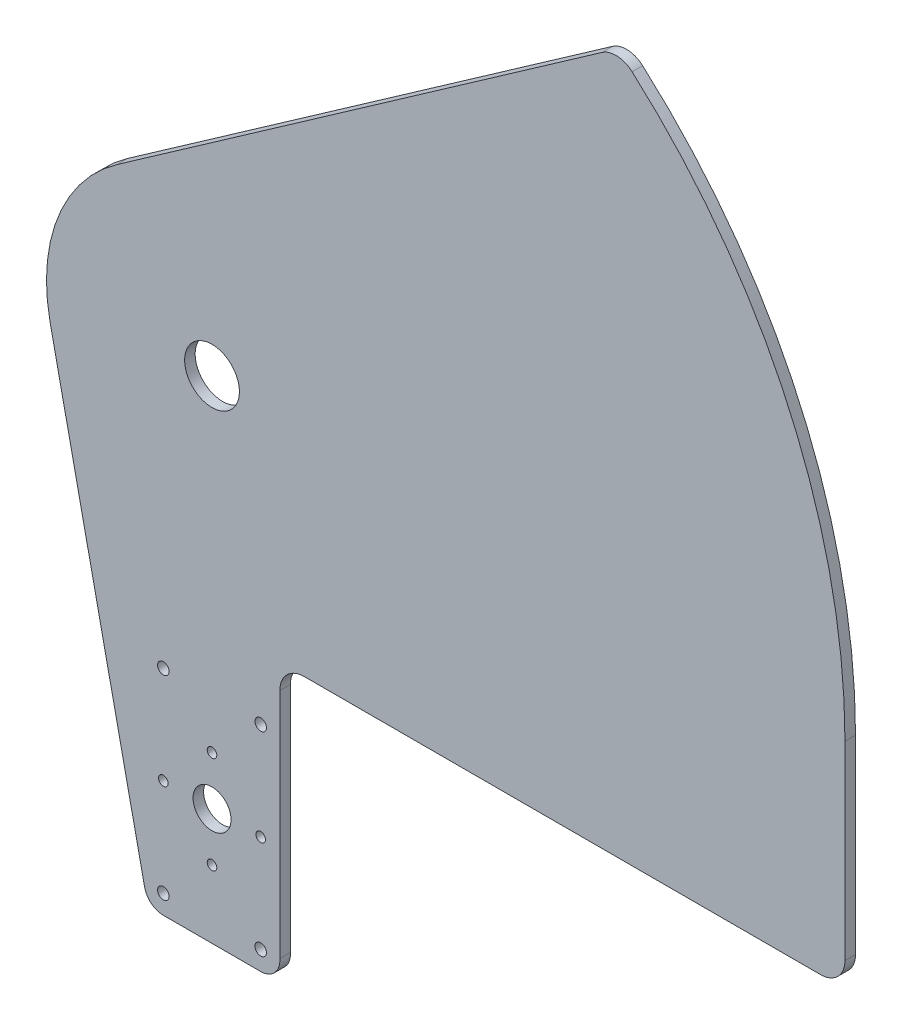
ISO-10303-21;
HEADER;
FILE_DESCRIPTION(('STEP AP214'),'2;1');
FILE_NAME('part.step','',(''),(''),'','','');
FILE_SCHEMA(('AUTOMOTIVE_DESIGN { 1 0 10303 214 1 1 1 1 }'));
ENDSEC;
DATA;
#1=APPLICATION_CONTEXT('core data for automotive mechanical design processes');
#2=APPLICATION_PROTOCOL_DEFINITION('international standard','automotive_design',2000,#1);
#3=PRODUCT_CONTEXT('',#1,'mechanical');
#4=PRODUCT('Part','Part','',(#3));
#5=PRODUCT_RELATED_PRODUCT_CATEGORY('part','',(#4));
#6=PRODUCT_DEFINITION_FORMATION('','',#4);
#7=PRODUCT_DEFINITION_CONTEXT('part definition',#1,'design');
#8=PRODUCT_DEFINITION('design','',#6,#7);
#9=PRODUCT_DEFINITION_SHAPE('','',#8);
#10=(LENGTH_UNIT() NAMED_UNIT(*) SI_UNIT(.MILLI.,.METRE.));
#11=(NAMED_UNIT(*) PLANE_ANGLE_UNIT() SI_UNIT($,.RADIAN.));
#12=(NAMED_UNIT(*) SI_UNIT($,.STERADIAN.) SOLID_ANGLE_UNIT());
#13=UNCERTAINTY_MEASURE_WITH_UNIT(LENGTH_MEASURE(1.E-05),#10,'distance_accuracy_value','');
#14=(GEOMETRIC_REPRESENTATION_CONTEXT(3) GLOBAL_UNCERTAINTY_ASSIGNED_CONTEXT((#13)) GLOBAL_UNIT_ASSIGNED_CONTEXT((#10,
#11,#12)) REPRESENTATION_CONTEXT('',''));
#15=CARTESIAN_POINT('',(0.,0.,0.));
#16=DIRECTION('',(0.,0.,1.));
#17=DIRECTION('',(1.,0.,0.));
#18=AXIS2_PLACEMENT_3D('',#15,#16,#17);
#19=CARTESIAN_POINT('',(0.,0.,2.75));
#20=DIRECTION('',(0.,0.,1.));
#21=DIRECTION('',(1.,0.,0.));
#22=AXIS2_PLACEMENT_3D('',#19,#20,#21);
#23=PLANE('',#22);
#24=CARTESIAN_POINT('',(25.4,-144.78,2.75));
#25=DIRECTION('',(0.,0.,1.));
#26=DIRECTION('',(1.,0.,0.));
#27=AXIS2_PLACEMENT_3D('',#24,#25,#26);
#28=CIRCLE('',#27,3.);
#29=CARTESIAN_POINT('',(28.4,-144.78,2.75));
#30=VERTEX_POINT('',#29);
#31=EDGE_CURVE('E434',#30,#30,#28,.F.);
#32=ORIENTED_EDGE('',*,*,#31,.T.);
#33=EDGE_LOOP('',(#32));
#34=FACE_BOUND('',#33,.T.);
#35=CARTESIAN_POINT('',(0.,0.,2.75));
#36=DIRECTION('',(0.,0.,1.));
#37=DIRECTION('',(1.,0.,0.));
#38=AXIS2_PLACEMENT_3D('',#35,#36,#37);
#39=CIRCLE('',#38,86.36);
#40=CARTESIAN_POINT('',(-49.5340610432764,70.7419705447973,2.75));
#41=VERTEX_POINT('',#40);
#42=CARTESIAN_POINT('',(-84.4506858636879,-18.0591045501353,2.75));
#43=VERTEX_POINT('',#42);
#44=EDGE_CURVE('E214',#41,#43,#39,.T.);
#45=ORIENTED_EDGE('',*,*,#44,.T.);
#46=DIRECTION('',(0.209114225916342,-0.97789122120991,0.));
#47=VECTOR('',#46,1.);
#48=CARTESIAN_POINT('',(-84.4506858636879,-18.0591045501353,2.75));
#49=LINE('',#48,#47);
#50=CARTESIAN_POINT('',(-35.1789122120991,-248.471142259163,2.75));
#51=VERTEX_POINT('',#50);
#52=EDGE_CURVE('E142',#43,#51,#49,.T.);
#53=ORIENTED_EDGE('',*,*,#52,.T.);
#54=CARTESIAN_POINT('',(-25.3999999999998,-246.38,2.75));
#55=DIRECTION('',(0.,0.,1.));
#56=DIRECTION('',(1.,0.,0.));
#57=AXIS2_PLACEMENT_3D('',#54,#55,#56);
#58=CIRCLE('',#57,10.0000000000001);
#59=CARTESIAN_POINT('',(-25.3999999999998,-256.38,2.75));
#60=VERTEX_POINT('',#59);
#61=EDGE_CURVE('E157',#60,#51,#58,.F.);
#62=ORIENTED_EDGE('',*,*,#61,.F.);
#63=DIRECTION('',(1.,0.,0.));
#64=VECTOR('',#63,1.);
#65=CARTESIAN_POINT('',(1.12062590178503E-12,-256.38,2.75));
#66=LINE('',#65,#64);
#67=CARTESIAN_POINT('',(25.4000000000002,-256.38,2.75));
#68=VERTEX_POINT('',#67);
#69=EDGE_CURVE('E156',#60,#68,#66,.T.);
#70=ORIENTED_EDGE('',*,*,#69,.T.);
#71=CARTESIAN_POINT('',(25.4000000000002,-246.38,2.75));
#72=DIRECTION('',(0.,0.,1.));
#73=DIRECTION('',(1.,0.,0.));
#74=AXIS2_PLACEMENT_3D('',#71,#72,#73);
#75=CIRCLE('',#74,10.);
#76=CARTESIAN_POINT('',(35.3690479138296,-245.593817011266,2.75));
#77=VERTEX_POINT('',#76);
#78=EDGE_CURVE('E282',#68,#77,#75,.T.);
#79=ORIENTED_EDGE('',*,*,#78,.T.);
#80=DIRECTION('',(0.,1.,0.));
#81=VECTOR('',#80,1.);
#82=CARTESIAN_POINT('',(35.3690479138296,0.,2.75));
#83=LINE('',#82,#81);
#84=CARTESIAN_POINT('',(35.3690479138296,-124.46,2.75));
#85=VERTEX_POINT('',#84);
#86=EDGE_CURVE('E276',#77,#85,#83,.T.);
#87=ORIENTED_EDGE('',*,*,#86,.T.);
#88=CARTESIAN_POINT('',(48.0690479138296,-124.46,2.74999999999997));
#89=DIRECTION('',(0.,0.,1.));
#90=DIRECTION('',(1.,0.,0.));
#91=AXIS2_PLACEMENT_3D('',#88,#89,#90);
#92=CIRCLE('',#91,12.7);
#93=CARTESIAN_POINT('',(48.0690479138296,-111.76,2.75));
#94=VERTEX_POINT('',#93);
#95=EDGE_CURVE('E46',#85,#94,#92,.F.);
#96=ORIENTED_EDGE('',*,*,#95,.T.);
#97=DIRECTION('',(1.,0.,0.));
#98=VECTOR('',#97,1.);
#99=CARTESIAN_POINT('',(0.,-111.76,2.75));
#100=LINE('',#99,#98);
#101=CARTESIAN_POINT('',(317.5,-111.76,2.75));
#102=VERTEX_POINT('',#101);
#103=EDGE_CURVE('E218',#94,#102,#100,.T.);
#104=ORIENTED_EDGE('',*,*,#103,.T.);
#105=CARTESIAN_POINT('',(317.5,-99.06,2.75));
#106=DIRECTION('',(0.,0.,1.));
#107=DIRECTION('',(1.,0.,0.));
#108=AXIS2_PLACEMENT_3D('',#105,#106,#107);
#109=CIRCLE('',#108,12.7);
#110=CARTESIAN_POINT('',(330.2,-99.06,2.75));
#111=VERTEX_POINT('',#110);
#112=EDGE_CURVE('E260',#102,#111,#109,.T.);
#113=ORIENTED_EDGE('',*,*,#112,.T.);
#114=DIRECTION('',(0.,1.,0.));
#115=VECTOR('',#114,1.);
#116=CARTESIAN_POINT('',(330.2,0.,2.75));
#117=LINE('',#116,#115);
#118=CARTESIAN_POINT('',(330.2,0.,2.75));
#119=VERTEX_POINT('',#118);
#120=EDGE_CURVE('E220',#111,#119,#117,.T.);
#121=ORIENTED_EDGE('',*,*,#120,.T.);
#122=CARTESIAN_POINT('',(0.,0.,2.75));
#123=DIRECTION('',(0.,0.,1.));
#124=DIRECTION('',(1.,0.,0.));
#125=AXIS2_PLACEMENT_3D('',#122,#123,#124);
#126=CIRCLE('',#125,330.2);
#127=CARTESIAN_POINT('',(219.164435587502,246.979736362342,2.75));
#128=VERTEX_POINT('',#127);
#129=EDGE_CURVE('E222',#119,#128,#126,.T.);
#130=ORIENTED_EDGE('',*,*,#129,.T.);
#131=CARTESIAN_POINT('',(210.735034218752,237.480515733021,2.75));
#132=DIRECTION('',(0.,0.,1.));
#133=DIRECTION('',(1.,0.,0.));
#134=AXIS2_PLACEMENT_3D('',#131,#132,#133);
#135=CIRCLE('',#134,12.7);
#136=CARTESIAN_POINT('',(203.450613477094,247.883746695491,2.75));
#137=VERTEX_POINT('',#136);
#138=EDGE_CURVE('E258',#128,#137,#135,.T.);
#139=ORIENTED_EDGE('',*,*,#138,.T.);
#140=DIRECTION('',(0.819152044288991,0.573576436351047,0.));
#141=VECTOR('',#140,1.);
#142=CARTESIAN_POINT('',(-49.5340610432765,70.7419705447973,2.75));
#143=LINE('',#142,#141);
#144=EDGE_CURVE('E225',#41,#137,#143,.T.);
#145=ORIENTED_EDGE('',*,*,#144,.F.);
#146=EDGE_LOOP('',(#45,#53,#62,#70,#79,#87,#96,#104,#113,#121,#130,#139,#145));
#147=FACE_BOUND('',#146,.T.);
#148=CARTESIAN_POINT('',(0.,0.,2.75));
#149=DIRECTION('',(0.,0.,1.));
#150=DIRECTION('',(1.,0.,0.));
#151=AXIS2_PLACEMENT_3D('',#148,#149,#150);
#152=CIRCLE('',#151,14.2875);
#153=CARTESIAN_POINT('',(14.2875,0.,2.75));
#154=VERTEX_POINT('',#153);
#155=EDGE_CURVE('E211',#154,#154,#152,.T.);
#156=ORIENTED_EDGE('',*,*,#155,.F.);
#157=EDGE_LOOP('',(#156));
#158=FACE_BOUND('',#157,.T.);
#159=CARTESIAN_POINT('',(0.,-195.58,2.75));
#160=DIRECTION('',(0.,0.,1.));
#161=DIRECTION('',(1.,0.,0.));
#162=AXIS2_PLACEMENT_3D('',#159,#160,#161);
#163=CIRCLE('',#162,9.906);
#164=CARTESIAN_POINT('',(9.90600000000003,-195.58,2.75));
#165=VERTEX_POINT('',#164);
#166=EDGE_CURVE('E176',#165,#165,#163,.T.);
#167=ORIENTED_EDGE('',*,*,#166,.F.);
#168=EDGE_LOOP('',(#167));
#169=FACE_BOUND('',#168,.T.);
#170=CARTESIAN_POINT('',(0.,-170.18,2.75));
#171=DIRECTION('',(0.,0.,1.));
#172=DIRECTION('',(1.,0.,0.));
#173=AXIS2_PLACEMENT_3D('',#170,#171,#172);
#174=CIRCLE('',#173,2.5);
#175=CARTESIAN_POINT('',(2.49999999999997,-170.18,2.75));
#176=VERTEX_POINT('',#175);
#177=EDGE_CURVE('E198',#176,#176,#174,.T.);
#178=ORIENTED_EDGE('',*,*,#177,.F.);
#179=EDGE_LOOP('',(#178));
#180=FACE_BOUND('',#179,.T.);
#181=CARTESIAN_POINT('',(25.4,-195.58,2.75));
#182=DIRECTION('',(0.,0.,1.));
#183=DIRECTION('',(1.,0.,0.));
#184=AXIS2_PLACEMENT_3D('',#181,#182,#183);
#185=CIRCLE('',#184,2.49999999999988);
#186=CARTESIAN_POINT('',(27.8999999999999,-195.58,2.75));
#187=VERTEX_POINT('',#186);
#188=EDGE_CURVE('E201',#187,#187,#185,.T.);
#189=ORIENTED_EDGE('',*,*,#188,.F.);
#190=EDGE_LOOP('',(#189));
#191=FACE_BOUND('',#190,.T.);
#192=CARTESIAN_POINT('',(0.,-220.98,2.75));
#193=DIRECTION('',(0.,0.,1.));
#194=DIRECTION('',(1.,0.,0.));
#195=AXIS2_PLACEMENT_3D('',#192,#193,#194);
#196=CIRCLE('',#195,2.50000000000001);
#197=CARTESIAN_POINT('',(2.5000000000001,-220.98,2.75));
#198=VERTEX_POINT('',#197);
#199=EDGE_CURVE('E204',#198,#198,#196,.T.);
#200=ORIENTED_EDGE('',*,*,#199,.F.);
#201=EDGE_LOOP('',(#200));
#202=FACE_BOUND('',#201,.T.);
#203=CARTESIAN_POINT('',(-25.4,-195.58,2.75));
#204=DIRECTION('',(0.,0.,1.));
#205=DIRECTION('',(1.,0.,0.));
#206=AXIS2_PLACEMENT_3D('',#203,#204,#205);
#207=CIRCLE('',#206,2.49999999999976);
#208=CARTESIAN_POINT('',(-22.9000000000002,-195.58,2.75));
#209=VERTEX_POINT('',#208);
#210=EDGE_CURVE('E192',#209,#209,#207,.T.);
#211=ORIENTED_EDGE('',*,*,#210,.F.);
#212=EDGE_LOOP('',(#211));
#213=FACE_BOUND('',#212,.T.);
#214=CARTESIAN_POINT('',(-25.3999999999998,-246.38,2.75));
#215=DIRECTION('',(0.,0.,1.));
#216=DIRECTION('',(1.,0.,0.));
#217=AXIS2_PLACEMENT_3D('',#214,#215,#216);
#218=CIRCLE('',#217,3.);
#219=CARTESIAN_POINT('',(-22.3999999999998,-246.38,2.75));
#220=VERTEX_POINT('',#219);
#221=EDGE_CURVE('E170',#220,#220,#218,.F.);
#222=ORIENTED_EDGE('',*,*,#221,.T.);
#223=EDGE_LOOP('',(#222));
#224=FACE_BOUND('',#223,.T.);
#225=CARTESIAN_POINT('',(25.4000000000002,-246.38,2.75));
#226=DIRECTION('',(0.,0.,1.));
#227=DIRECTION('',(1.,0.,0.));
#228=AXIS2_PLACEMENT_3D('',#225,#226,#227);
#229=CIRCLE('',#228,2.99999999999999);
#230=CARTESIAN_POINT('',(28.4000000000002,-246.38,2.75));
#231=VERTEX_POINT('',#230);
#232=EDGE_CURVE('E171',#231,#231,#229,.T.);
#233=ORIENTED_EDGE('',*,*,#232,.F.);
#234=EDGE_LOOP('',(#233));
#235=FACE_BOUND('',#234,.T.);
#236=CARTESIAN_POINT('',(-25.4,-144.78,2.75));
#237=DIRECTION('',(0.,0.,1.));
#238=DIRECTION('',(1.,0.,0.));
#239=AXIS2_PLACEMENT_3D('',#236,#237,#238);
#240=CIRCLE('',#239,3.);
#241=CARTESIAN_POINT('',(-22.4,-144.78,2.75));
#242=VERTEX_POINT('',#241);
#243=EDGE_CURVE('E173',#242,#242,#240,.T.);
#244=ORIENTED_EDGE('',*,*,#243,.F.);
#245=EDGE_LOOP('',(#244));
#246=FACE_BOUND('',#245,.T.);
#247=ADVANCED_FACE('F38',(#34,#147,#158,#169,#180,#191,#202,#213,#224,#235,#246),#23,.T.);
#248=CARTESIAN_POINT('',(0.,0.,-2.75));
#249=DIRECTION('',(0.,0.,1.));
#250=DIRECTION('',(1.,0.,0.));
#251=AXIS2_PLACEMENT_3D('',#248,#249,#250);
#252=PLANE('',#251);
#253=CARTESIAN_POINT('',(25.4000000000002,-246.38,-2.74999999999997));
#254=DIRECTION('',(0.,0.,1.));
#255=DIRECTION('',(1.,0.,0.));
#256=AXIS2_PLACEMENT_3D('',#253,#254,#255);
#257=CIRCLE('',#256,2.99999999999999);
#258=CARTESIAN_POINT('',(28.4000000000002,-246.38,-2.74999999999997));
#259=VERTEX_POINT('',#258);
#260=EDGE_CURVE('E167',#259,#259,#257,.F.);
#261=ORIENTED_EDGE('',*,*,#260,.F.);
#262=EDGE_LOOP('',(#261));
#263=FACE_BOUND('',#262,.T.);
#264=CARTESIAN_POINT('',(-25.3999999999998,-246.38,-2.74999999999997));
#265=DIRECTION('',(0.,0.,1.));
#266=DIRECTION('',(1.,0.,0.));
#267=AXIS2_PLACEMENT_3D('',#264,#265,#266);
#268=CIRCLE('',#267,3.);
#269=CARTESIAN_POINT('',(-22.3999999999998,-246.38,-2.74999999999997));
#270=VERTEX_POINT('',#269);
#271=EDGE_CURVE('E174',#270,#270,#268,.T.);
#272=ORIENTED_EDGE('',*,*,#271,.T.);
#273=EDGE_LOOP('',(#272));
#274=FACE_BOUND('',#273,.T.);
#275=CARTESIAN_POINT('',(0.,-220.98,-2.75));
#276=DIRECTION('',(0.,0.,1.));
#277=DIRECTION('',(1.,0.,0.));
#278=AXIS2_PLACEMENT_3D('',#275,#276,#277);
#279=CIRCLE('',#278,2.50000000000001);
#280=CARTESIAN_POINT('',(2.5000000000001,-220.98,-2.75));
#281=VERTEX_POINT('',#280);
#282=EDGE_CURVE('E189',#281,#281,#279,.F.);
#283=ORIENTED_EDGE('',*,*,#282,.F.);
#284=EDGE_LOOP('',(#283));
#285=FACE_BOUND('',#284,.T.);
#286=CARTESIAN_POINT('',(0.,-170.18,-2.75));
#287=DIRECTION('',(0.,0.,1.));
#288=DIRECTION('',(1.,0.,0.));
#289=AXIS2_PLACEMENT_3D('',#286,#287,#288);
#290=CIRCLE('',#289,2.5);
#291=CARTESIAN_POINT('',(2.49999999999997,-170.18,-2.75));
#292=VERTEX_POINT('',#291);
#293=EDGE_CURVE('E186',#292,#292,#290,.F.);
#294=ORIENTED_EDGE('',*,*,#293,.F.);
#295=EDGE_LOOP('',(#294));
#296=FACE_BOUND('',#295,.T.);
#297=CARTESIAN_POINT('',(-25.4,-195.58,-2.75));
#298=DIRECTION('',(0.,0.,1.));
#299=DIRECTION('',(1.,0.,0.));
#300=AXIS2_PLACEMENT_3D('',#297,#298,#299);
#301=CIRCLE('',#300,2.49999999999976);
#302=CARTESIAN_POINT('',(-22.9000000000002,-195.58,-2.75));
#303=VERTEX_POINT('',#302);
#304=EDGE_CURVE('E184',#303,#303,#301,.F.);
#305=ORIENTED_EDGE('',*,*,#304,.F.);
#306=EDGE_LOOP('',(#305));
#307=FACE_BOUND('',#306,.T.);
#308=CARTESIAN_POINT('',(0.,-195.58,-2.75));
#309=DIRECTION('',(0.,0.,1.));
#310=DIRECTION('',(1.,0.,0.));
#311=AXIS2_PLACEMENT_3D('',#308,#309,#310);
#312=CIRCLE('',#311,9.906);
#313=CARTESIAN_POINT('',(9.90600000000003,-195.58,-2.75));
#314=VERTEX_POINT('',#313);
#315=EDGE_CURVE('E181',#314,#314,#312,.F.);
#316=ORIENTED_EDGE('',*,*,#315,.F.);
#317=EDGE_LOOP('',(#316));
#318=FACE_BOUND('',#317,.T.);
#319=CARTESIAN_POINT('',(25.4,-195.58,-2.75));
#320=DIRECTION('',(0.,0.,1.));
#321=DIRECTION('',(1.,0.,0.));
#322=AXIS2_PLACEMENT_3D('',#319,#320,#321);
#323=CIRCLE('',#322,2.49999999999988);
#324=CARTESIAN_POINT('',(27.8999999999999,-195.58,-2.75));
#325=VERTEX_POINT('',#324);
#326=EDGE_CURVE('E185',#325,#325,#323,.F.);
#327=ORIENTED_EDGE('',*,*,#326,.F.);
#328=EDGE_LOOP('',(#327));
#329=FACE_BOUND('',#328,.T.);
#330=CARTESIAN_POINT('',(0.,0.,-2.75));
#331=DIRECTION('',(0.,0.,1.));
#332=DIRECTION('',(1.,0.,0.));
#333=AXIS2_PLACEMENT_3D('',#330,#331,#332);
#334=CIRCLE('',#333,14.2875);
#335=CARTESIAN_POINT('',(14.2875,0.,-2.75));
#336=VERTEX_POINT('',#335);
#337=EDGE_CURVE('E195',#336,#336,#334,.T.);
#338=ORIENTED_EDGE('',*,*,#337,.T.);
#339=EDGE_LOOP('',(#338));
#340=FACE_BOUND('',#339,.T.);
#341=DIRECTION('',(-0.209114225916342,0.97789122120991,0.));
#342=VECTOR('',#341,1.);
#343=CARTESIAN_POINT('',(-84.4506858636879,-18.0591045501353,-2.74999999999997));
#344=LINE('',#343,#342);
#345=CARTESIAN_POINT('',(-35.1789122120991,-248.471142259163,-2.74999999999997));
#346=VERTEX_POINT('',#345);
#347=CARTESIAN_POINT('',(-84.4506858636878,-18.0591045501353,-2.74999999999997));
#348=VERTEX_POINT('',#347);
#349=EDGE_CURVE('E141',#346,#348,#344,.T.);
#350=ORIENTED_EDGE('',*,*,#349,.T.);
#351=CARTESIAN_POINT('',(0.,0.,-2.75));
#352=DIRECTION('',(0.,0.,1.));
#353=DIRECTION('',(1.,0.,0.));
#354=AXIS2_PLACEMENT_3D('',#351,#352,#353);
#355=CIRCLE('',#354,86.36);
#356=CARTESIAN_POINT('',(-49.5340610432764,70.7419705447973,-2.75));
#357=VERTEX_POINT('',#356);
#358=EDGE_CURVE('E231',#357,#348,#355,.T.);
#359=ORIENTED_EDGE('',*,*,#358,.F.);
#360=DIRECTION('',(0.819152044288991,0.573576436351047,0.));
#361=VECTOR('',#360,1.);
#362=CARTESIAN_POINT('',(-49.5340610432765,70.7419705447973,-2.75));
#363=LINE('',#362,#361);
#364=CARTESIAN_POINT('',(203.450613477094,247.883746695491,-2.75));
#365=VERTEX_POINT('',#364);
#366=EDGE_CURVE('E215',#357,#365,#363,.T.);
#367=ORIENTED_EDGE('',*,*,#366,.T.);
#368=CARTESIAN_POINT('',(210.735034218752,237.480515733021,-2.75));
#369=DIRECTION('',(0.,0.,1.));
#370=DIRECTION('',(1.,0.,0.));
#371=AXIS2_PLACEMENT_3D('',#368,#369,#370);
#372=CIRCLE('',#371,12.7);
#373=CARTESIAN_POINT('',(219.164435587502,246.979736362342,-2.75));
#374=VERTEX_POINT('',#373);
#375=EDGE_CURVE('E250',#365,#374,#372,.F.);
#376=ORIENTED_EDGE('',*,*,#375,.T.);
#377=CARTESIAN_POINT('',(0.,0.,-2.75));
#378=DIRECTION('',(0.,0.,1.));
#379=DIRECTION('',(1.,0.,0.));
#380=AXIS2_PLACEMENT_3D('',#377,#378,#379);
#381=CIRCLE('',#380,330.2);
#382=CARTESIAN_POINT('',(330.2,0.,-2.75));
#383=VERTEX_POINT('',#382);
#384=EDGE_CURVE('E238',#383,#374,#381,.T.);
#385=ORIENTED_EDGE('',*,*,#384,.F.);
#386=DIRECTION('',(0.,1.,0.));
#387=VECTOR('',#386,1.);
#388=CARTESIAN_POINT('',(330.2,0.,-2.75));
#389=LINE('',#388,#387);
#390=CARTESIAN_POINT('',(330.2,-99.06,-2.75));
#391=VERTEX_POINT('',#390);
#392=EDGE_CURVE('E236',#391,#383,#389,.T.);
#393=ORIENTED_EDGE('',*,*,#392,.F.);
#394=CARTESIAN_POINT('',(317.5,-99.06,-2.75));
#395=DIRECTION('',(0.,0.,1.));
#396=DIRECTION('',(1.,0.,0.));
#397=AXIS2_PLACEMENT_3D('',#394,#395,#396);
#398=CIRCLE('',#397,12.7);
#399=CARTESIAN_POINT('',(317.5,-111.76,-2.75));
#400=VERTEX_POINT('',#399);
#401=EDGE_CURVE('E252',#391,#400,#398,.F.);
#402=ORIENTED_EDGE('',*,*,#401,.T.);
#403=DIRECTION('',(1.,0.,0.));
#404=VECTOR('',#403,1.);
#405=CARTESIAN_POINT('',(0.,-111.76,-2.75));
#406=LINE('',#405,#404);
#407=CARTESIAN_POINT('',(48.0690479138296,-111.76,-2.75));
#408=VERTEX_POINT('',#407);
#409=EDGE_CURVE('E234',#408,#400,#406,.T.);
#410=ORIENTED_EDGE('',*,*,#409,.F.);
#411=CARTESIAN_POINT('',(48.0690479138296,-124.46,-2.74999999999997));
#412=DIRECTION('',(0.,0.,1.));
#413=DIRECTION('',(1.,0.,0.));
#414=AXIS2_PLACEMENT_3D('',#411,#412,#413);
#415=CIRCLE('',#414,12.7);
#416=CARTESIAN_POINT('',(35.3690479138296,-124.46,-2.74999999999997));
#417=VERTEX_POINT('',#416);
#418=EDGE_CURVE('E11',#408,#417,#415,.T.);
#419=ORIENTED_EDGE('',*,*,#418,.T.);
#420=DIRECTION('',(0.,-1.,0.));
#421=VECTOR('',#420,1.);
#422=CARTESIAN_POINT('',(35.3690479138296,0.,-2.74999999999997));
#423=LINE('',#422,#421);
#424=CARTESIAN_POINT('',(35.3690479138296,-245.593817011266,-2.74999999999997));
#425=VERTEX_POINT('',#424);
#426=EDGE_CURVE('E179',#417,#425,#423,.T.);
#427=ORIENTED_EDGE('',*,*,#426,.T.);
#428=CARTESIAN_POINT('',(25.4000000000002,-246.38,-2.74999999999997));
#429=DIRECTION('',(0.,0.,1.));
#430=DIRECTION('',(1.,0.,0.));
#431=AXIS2_PLACEMENT_3D('',#428,#429,#430);
#432=CIRCLE('',#431,10.);
#433=CARTESIAN_POINT('',(25.4000000000002,-256.38,-2.74999999999997));
#434=VERTEX_POINT('',#433);
#435=EDGE_CURVE('E137',#425,#434,#432,.F.);
#436=ORIENTED_EDGE('',*,*,#435,.T.);
#437=DIRECTION('',(-1.,0.,0.));
#438=VECTOR('',#437,1.);
#439=CARTESIAN_POINT('',(1.12062590178503E-12,-256.38,-2.74999999999997));
#440=LINE('',#439,#438);
#441=CARTESIAN_POINT('',(-25.3999999999998,-256.38,-2.74999999999997));
#442=VERTEX_POINT('',#441);
#443=EDGE_CURVE('E130',#434,#442,#440,.T.);
#444=ORIENTED_EDGE('',*,*,#443,.T.);
#445=CARTESIAN_POINT('',(-25.3999999999998,-246.38,-2.74999999999997));
#446=DIRECTION('',(0.,0.,1.));
#447=DIRECTION('',(1.,0.,0.));
#448=AXIS2_PLACEMENT_3D('',#445,#446,#447);
#449=CIRCLE('',#448,10.0000000000001);
#450=EDGE_CURVE('E134',#346,#442,#449,.T.);
#451=ORIENTED_EDGE('',*,*,#450,.F.);
#452=EDGE_LOOP('',(#350,#359,#367,#376,#385,#393,#402,#410,#419,#427,#436,#444,#451));
#453=FACE_BOUND('',#452,.T.);
#454=CARTESIAN_POINT('',(25.4,-144.78,-2.75));
#455=DIRECTION('',(0.,0.,1.));
#456=DIRECTION('',(1.,0.,0.));
#457=AXIS2_PLACEMENT_3D('',#454,#455,#456);
#458=CIRCLE('',#457,3.);
#459=CARTESIAN_POINT('',(28.4,-144.78,-2.75));
#460=VERTEX_POINT('',#459);
#461=EDGE_CURVE('E439',#460,#460,#458,.F.);
#462=ORIENTED_EDGE('',*,*,#461,.F.);
#463=EDGE_LOOP('',(#462));
#464=FACE_BOUND('',#463,.T.);
#465=CARTESIAN_POINT('',(-25.4,-144.78,-2.75));
#466=DIRECTION('',(0.,0.,1.));
#467=DIRECTION('',(1.,0.,0.));
#468=AXIS2_PLACEMENT_3D('',#465,#466,#467);
#469=CIRCLE('',#468,3.);
#470=CARTESIAN_POINT('',(-22.4,-144.78,-2.75));
#471=VERTEX_POINT('',#470);
#472=EDGE_CURVE('E436',#471,#471,#469,.T.);
#473=ORIENTED_EDGE('',*,*,#472,.T.);
#474=EDGE_LOOP('',(#473));
#475=FACE_BOUND('',#474,.T.);
#476=ADVANCED_FACE('F132',(#263,#274,#285,#296,#307,#318,#329,#340,#453,#464,#475),#252,.F.);
#477=CARTESIAN_POINT('',(0.,0.,2.75));
#478=DIRECTION('',(0.,0.,-1.));
#479=DIRECTION('',(-1.,0.,0.));
#480=AXIS2_PLACEMENT_3D('',#477,#478,#479);
#481=CYLINDRICAL_SURFACE('',#480,86.36);
#482=DIRECTION('',(0.,0.,1.));
#483=VECTOR('',#482,1.);
#484=CARTESIAN_POINT('',(-84.4506858636879,-18.0591045501353,-269.510259615299));
#485=LINE('',#484,#483);
#486=EDGE_CURVE('E164',#348,#43,#485,.T.);
#487=ORIENTED_EDGE('',*,*,#486,.T.);
#488=ORIENTED_EDGE('',*,*,#44,.F.);
#489=DIRECTION('',(0.,0.,-1.));
#490=VECTOR('',#489,1.);
#491=CARTESIAN_POINT('',(-49.5340610432764,70.7419705447973,2.75));
#492=LINE('',#491,#490);
#493=EDGE_CURVE('E228',#41,#357,#492,.T.);
#494=ORIENTED_EDGE('',*,*,#493,.T.);
#495=ORIENTED_EDGE('',*,*,#358,.T.);
#496=EDGE_LOOP('',(#487,#488,#494,#495));
#497=FACE_BOUND('',#496,.T.);
#498=ADVANCED_FACE('F300',(#497),#481,.T.);
#499=CARTESIAN_POINT('',(0.,-111.76,2.75));
#500=DIRECTION('',(0.,1.,0.));
#501=DIRECTION('',(0.,0.,1.));
#502=AXIS2_PLACEMENT_3D('',#499,#500,#501);
#503=PLANE('',#502);
#504=ORIENTED_EDGE('',*,*,#103,.F.);
#505=DIRECTION('',(0.,0.,1.));
#506=VECTOR('',#505,1.);
#507=CARTESIAN_POINT('',(48.0690479138296,-111.76,2.75));
#508=LINE('',#507,#506);
#509=EDGE_CURVE('E59',#94,#408,#508,.F.);
#510=ORIENTED_EDGE('',*,*,#509,.T.);
#511=ORIENTED_EDGE('',*,*,#409,.T.);
#512=DIRECTION('',(0.,0.,-1.));
#513=VECTOR('',#512,1.);
#514=CARTESIAN_POINT('',(317.5,-111.76,2.75));
#515=LINE('',#514,#513);
#516=EDGE_CURVE('E255',#400,#102,#515,.F.);
#517=ORIENTED_EDGE('',*,*,#516,.T.);
#518=EDGE_LOOP('',(#504,#510,#511,#517));
#519=FACE_BOUND('',#518,.T.);
#520=ADVANCED_FACE('F346',(#519),#503,.F.);
#521=CARTESIAN_POINT('',(330.2,0.,2.75));
#522=DIRECTION('',(-1.,0.,0.));
#523=DIRECTION('',(0.,0.,1.));
#524=AXIS2_PLACEMENT_3D('',#521,#522,#523);
#525=PLANE('',#524);
#526=ORIENTED_EDGE('',*,*,#120,.F.);
#527=DIRECTION('',(0.,0.,-1.));
#528=VECTOR('',#527,1.);
#529=CARTESIAN_POINT('',(330.2,-99.06,2.75));
#530=LINE('',#529,#528);
#531=EDGE_CURVE('E247',#111,#391,#530,.T.);
#532=ORIENTED_EDGE('',*,*,#531,.T.);
#533=ORIENTED_EDGE('',*,*,#392,.T.);
#534=DIRECTION('',(0.,0.,-1.));
#535=VECTOR('',#534,1.);
#536=CARTESIAN_POINT('',(330.2,0.,2.75));
#537=LINE('',#536,#535);
#538=EDGE_CURVE('E244',#119,#383,#537,.T.);
#539=ORIENTED_EDGE('',*,*,#538,.F.);
#540=EDGE_LOOP('',(#526,#532,#533,#539));
#541=FACE_BOUND('',#540,.T.);
#542=ADVANCED_FACE('F329',(#541),#525,.F.);
#543=CARTESIAN_POINT('',(0.,0.,2.75));
#544=DIRECTION('',(0.,0.,-1.));
#545=DIRECTION('',(-1.,0.,0.));
#546=AXIS2_PLACEMENT_3D('',#543,#544,#545);
#547=CYLINDRICAL_SURFACE('',#546,330.2);
#548=ORIENTED_EDGE('',*,*,#384,.T.);
#549=DIRECTION('',(0.,0.,-1.));
#550=VECTOR('',#549,1.);
#551=CARTESIAN_POINT('',(219.164435587502,246.979736362342,2.75));
#552=LINE('',#551,#550);
#553=EDGE_CURVE('E265',#374,#128,#552,.F.);
#554=ORIENTED_EDGE('',*,*,#553,.T.);
#555=ORIENTED_EDGE('',*,*,#129,.F.);
#556=ORIENTED_EDGE('',*,*,#538,.T.);
#557=EDGE_LOOP('',(#548,#554,#555,#556));
#558=FACE_BOUND('',#557,.T.);
#559=ADVANCED_FACE('F319',(#558),#547,.T.);
#560=CARTESIAN_POINT('',(0.,0.,2.75));
#561=DIRECTION('',(0.,0.,-1.));
#562=DIRECTION('',(-1.,0.,0.));
#563=AXIS2_PLACEMENT_3D('',#560,#561,#562);
#564=CYLINDRICAL_SURFACE('',#563,14.2875);
#565=ORIENTED_EDGE('',*,*,#155,.T.);
#566=EDGE_LOOP('',(#565));
#567=FACE_BOUND('',#566,.T.);
#568=ORIENTED_EDGE('',*,*,#337,.F.);
#569=EDGE_LOOP('',(#568));
#570=FACE_BOUND('',#569,.T.);
#571=ADVANCED_FACE('F316',(#567,#570),#564,.F.);
#572=CARTESIAN_POINT('',(-49.5340610432765,70.7419705447973,2.75));
#573=DIRECTION('',(-0.573576436351047,0.819152044288991,0.));
#574=DIRECTION('',(-0.819152044288991,-0.573576436351047,0.));
#575=AXIS2_PLACEMENT_3D('',#572,#573,#574);
#576=PLANE('',#575);
#577=ORIENTED_EDGE('',*,*,#144,.T.);
#578=DIRECTION('',(0.,0.,1.));
#579=VECTOR('',#578,1.);
#580=CARTESIAN_POINT('',(203.450613477094,247.883746695491,-2.75));
#581=LINE('',#580,#579);
#582=EDGE_CURVE('E262',#137,#365,#581,.F.);
#583=ORIENTED_EDGE('',*,*,#582,.T.);
#584=ORIENTED_EDGE('',*,*,#366,.F.);
#585=ORIENTED_EDGE('',*,*,#493,.F.);
#586=EDGE_LOOP('',(#577,#583,#584,#585));
#587=FACE_BOUND('',#586,.T.);
#588=ADVANCED_FACE('F318',(#587),#576,.T.);
#589=CARTESIAN_POINT('',(0.,-220.98,-239.074795992832));
#590=DIRECTION('',(0.,0.,1.));
#591=DIRECTION('',(1.,0.,0.));
#592=AXIS2_PLACEMENT_3D('',#589,#590,#591);
#593=CYLINDRICAL_SURFACE('',#592,2.50000000000001);
#594=ORIENTED_EDGE('',*,*,#282,.T.);
#595=EDGE_LOOP('',(#594));
#596=FACE_BOUND('',#595,.T.);
#597=ORIENTED_EDGE('',*,*,#199,.T.);
#598=EDGE_LOOP('',(#597));
#599=FACE_BOUND('',#598,.T.);
#600=ADVANCED_FACE('F326',(#596,#599),#593,.F.);
#601=CARTESIAN_POINT('',(25.4,-195.58,-239.074795992832));
#602=DIRECTION('',(0.,0.,1.));
#603=DIRECTION('',(1.,0.,0.));
#604=AXIS2_PLACEMENT_3D('',#601,#602,#603);
#605=CYLINDRICAL_SURFACE('',#604,2.49999999999988);
#606=ORIENTED_EDGE('',*,*,#326,.T.);
#607=EDGE_LOOP('',(#606));
#608=FACE_BOUND('',#607,.T.);
#609=ORIENTED_EDGE('',*,*,#188,.T.);
#610=EDGE_LOOP('',(#609));
#611=FACE_BOUND('',#610,.T.);
#612=ADVANCED_FACE('F406',(#608,#611),#605,.F.);
#613=CARTESIAN_POINT('',(0.,-170.18,-239.074795992832));
#614=DIRECTION('',(0.,0.,1.));
#615=DIRECTION('',(1.,0.,0.));
#616=AXIS2_PLACEMENT_3D('',#613,#614,#615);
#617=CYLINDRICAL_SURFACE('',#616,2.5);
#618=ORIENTED_EDGE('',*,*,#293,.T.);
#619=EDGE_LOOP('',(#618));
#620=FACE_BOUND('',#619,.T.);
#621=ORIENTED_EDGE('',*,*,#177,.T.);
#622=EDGE_LOOP('',(#621));
#623=FACE_BOUND('',#622,.T.);
#624=ADVANCED_FACE('F409',(#620,#623),#617,.F.);
#625=CARTESIAN_POINT('',(0.,-195.58,-239.074795992832));
#626=DIRECTION('',(0.,0.,1.));
#627=DIRECTION('',(1.,0.,0.));
#628=AXIS2_PLACEMENT_3D('',#625,#626,#627);
#629=CYLINDRICAL_SURFACE('',#628,9.906);
#630=ORIENTED_EDGE('',*,*,#315,.T.);
#631=EDGE_LOOP('',(#630));
#632=FACE_BOUND('',#631,.T.);
#633=ORIENTED_EDGE('',*,*,#166,.T.);
#634=EDGE_LOOP('',(#633));
#635=FACE_BOUND('',#634,.T.);
#636=ADVANCED_FACE('F341',(#632,#635),#629,.F.);
#637=CARTESIAN_POINT('',(-25.4,-195.58,-239.074795992832));
#638=DIRECTION('',(0.,0.,1.));
#639=DIRECTION('',(1.,0.,0.));
#640=AXIS2_PLACEMENT_3D('',#637,#638,#639);
#641=CYLINDRICAL_SURFACE('',#640,2.49999999999976);
#642=ORIENTED_EDGE('',*,*,#304,.T.);
#643=EDGE_LOOP('',(#642));
#644=FACE_BOUND('',#643,.T.);
#645=ORIENTED_EDGE('',*,*,#210,.T.);
#646=EDGE_LOOP('',(#645));
#647=FACE_BOUND('',#646,.T.);
#648=ADVANCED_FACE('F400',(#644,#647),#641,.F.);
#649=CARTESIAN_POINT('',(317.5,-99.06,2.75));
#650=DIRECTION('',(0.,0.,-1.));
#651=DIRECTION('',(-1.,0.,0.));
#652=AXIS2_PLACEMENT_3D('',#649,#650,#651);
#653=CYLINDRICAL_SURFACE('',#652,12.7);
#654=ORIENTED_EDGE('',*,*,#112,.F.);
#655=ORIENTED_EDGE('',*,*,#516,.F.);
#656=ORIENTED_EDGE('',*,*,#401,.F.);
#657=ORIENTED_EDGE('',*,*,#531,.F.);
#658=EDGE_LOOP('',(#654,#655,#656,#657));
#659=FACE_BOUND('',#658,.T.);
#660=ADVANCED_FACE('F373',(#659),#653,.T.);
#661=CARTESIAN_POINT('',(210.735034218752,237.480515733021,2.75));
#662=DIRECTION('',(0.,0.,-1.));
#663=DIRECTION('',(-1.,0.,0.));
#664=AXIS2_PLACEMENT_3D('',#661,#662,#663);
#665=CYLINDRICAL_SURFACE('',#664,12.7);
#666=ORIENTED_EDGE('',*,*,#138,.F.);
#667=ORIENTED_EDGE('',*,*,#553,.F.);
#668=ORIENTED_EDGE('',*,*,#375,.F.);
#669=ORIENTED_EDGE('',*,*,#582,.F.);
#670=EDGE_LOOP('',(#666,#667,#668,#669));
#671=FACE_BOUND('',#670,.T.);
#672=ADVANCED_FACE('F362',(#671),#665,.T.);
#673=CARTESIAN_POINT('',(1.12062590178503E-12,-256.38,-269.510259615299));
#674=DIRECTION('',(0.,-1.,0.));
#675=DIRECTION('',(1.,0.,0.));
#676=AXIS2_PLACEMENT_3D('',#673,#674,#675);
#677=PLANE('',#676);
#678=ORIENTED_EDGE('',*,*,#443,.F.);
#679=DIRECTION('',(0.,0.,1.));
#680=VECTOR('',#679,1.);
#681=CARTESIAN_POINT('',(25.4000000000002,-256.38,-269.510259615299));
#682=LINE('',#681,#680);
#683=EDGE_CURVE('E151',#434,#68,#682,.T.);
#684=ORIENTED_EDGE('',*,*,#683,.T.);
#685=ORIENTED_EDGE('',*,*,#69,.F.);
#686=DIRECTION('',(0.,0.,1.));
#687=VECTOR('',#686,1.);
#688=CARTESIAN_POINT('',(-25.3999999999998,-256.38,-269.510259615299));
#689=LINE('',#688,#687);
#690=EDGE_CURVE('E148',#442,#60,#689,.T.);
#691=ORIENTED_EDGE('',*,*,#690,.F.);
#692=EDGE_LOOP('',(#678,#684,#685,#691));
#693=FACE_BOUND('',#692,.T.);
#694=ADVANCED_FACE('F154',(#693),#677,.T.);
#695=CARTESIAN_POINT('',(-25.3999999999998,-246.38,-269.510259615299));
#696=DIRECTION('',(0.,0.,1.));
#697=DIRECTION('',(1.,0.,0.));
#698=AXIS2_PLACEMENT_3D('',#695,#696,#697);
#699=CYLINDRICAL_SURFACE('',#698,10.0000000000001);
#700=DIRECTION('',(0.,0.,1.));
#701=VECTOR('',#700,1.);
#702=CARTESIAN_POINT('',(-35.1789122120991,-248.471142259163,-269.510259615299));
#703=LINE('',#702,#701);
#704=EDGE_CURVE('E150',#346,#51,#703,.T.);
#705=ORIENTED_EDGE('',*,*,#704,.F.);
#706=ORIENTED_EDGE('',*,*,#450,.T.);
#707=ORIENTED_EDGE('',*,*,#690,.T.);
#708=ORIENTED_EDGE('',*,*,#61,.T.);
#709=EDGE_LOOP('',(#705,#706,#707,#708));
#710=FACE_BOUND('',#709,.T.);
#711=ADVANCED_FACE('F146',(#710),#699,.T.);
#712=CARTESIAN_POINT('',(-84.4506858636879,-18.0591045501353,-269.510259615299));
#713=DIRECTION('',(-0.97789122120991,-0.209114225916342,0.));
#714=DIRECTION('',(0.209114225916342,-0.97789122120991,0.));
#715=AXIS2_PLACEMENT_3D('',#712,#713,#714);
#716=PLANE('',#715);
#717=ORIENTED_EDGE('',*,*,#349,.F.);
#718=ORIENTED_EDGE('',*,*,#704,.T.);
#719=ORIENTED_EDGE('',*,*,#52,.F.);
#720=ORIENTED_EDGE('',*,*,#486,.F.);
#721=EDGE_LOOP('',(#717,#718,#719,#720));
#722=FACE_BOUND('',#721,.T.);
#723=ADVANCED_FACE('F393',(#722),#716,.T.);
#724=CARTESIAN_POINT('',(35.3690479138296,0.,-269.510259615299));
#725=DIRECTION('',(1.,0.,0.));
#726=DIRECTION('',(0.,0.,-1.));
#727=AXIS2_PLACEMENT_3D('',#724,#725,#726);
#728=PLANE('',#727);
#729=ORIENTED_EDGE('',*,*,#426,.F.);
#730=DIRECTION('',(0.,0.,1.));
#731=VECTOR('',#730,1.);
#732=CARTESIAN_POINT('',(35.3690479138296,-124.46,-269.510259615299));
#733=LINE('',#732,#731);
#734=EDGE_CURVE('E267',#417,#85,#733,.T.);
#735=ORIENTED_EDGE('',*,*,#734,.T.);
#736=ORIENTED_EDGE('',*,*,#86,.F.);
#737=DIRECTION('',(0.,0.,1.));
#738=VECTOR('',#737,1.);
#739=CARTESIAN_POINT('',(35.3690479138296,-245.593817011266,-269.510259615299));
#740=LINE('',#739,#738);
#741=EDGE_CURVE('E168',#425,#77,#740,.T.);
#742=ORIENTED_EDGE('',*,*,#741,.F.);
#743=EDGE_LOOP('',(#729,#735,#736,#742));
#744=FACE_BOUND('',#743,.T.);
#745=ADVANCED_FACE('F274',(#744),#728,.T.);
#746=CARTESIAN_POINT('',(25.4000000000002,-246.38,-269.510259615299));
#747=DIRECTION('',(0.,0.,1.));
#748=DIRECTION('',(1.,0.,0.));
#749=AXIS2_PLACEMENT_3D('',#746,#747,#748);
#750=CYLINDRICAL_SURFACE('',#749,2.99999999999999);
#751=ORIENTED_EDGE('',*,*,#260,.T.);
#752=EDGE_LOOP('',(#751));
#753=FACE_BOUND('',#752,.T.);
#754=ORIENTED_EDGE('',*,*,#232,.T.);
#755=EDGE_LOOP('',(#754));
#756=FACE_BOUND('',#755,.T.);
#757=ADVANCED_FACE('F295',(#753,#756),#750,.F.);
#758=CARTESIAN_POINT('',(-25.3999999999998,-246.38,-269.510259615299));
#759=DIRECTION('',(0.,0.,1.));
#760=DIRECTION('',(1.,0.,0.));
#761=AXIS2_PLACEMENT_3D('',#758,#759,#760);
#762=CYLINDRICAL_SURFACE('',#761,3.);
#763=ORIENTED_EDGE('',*,*,#271,.F.);
#764=EDGE_LOOP('',(#763));
#765=FACE_BOUND('',#764,.T.);
#766=ORIENTED_EDGE('',*,*,#221,.F.);
#767=EDGE_LOOP('',(#766));
#768=FACE_BOUND('',#767,.T.);
#769=ADVANCED_FACE('F378',(#765,#768),#762,.F.);
#770=CARTESIAN_POINT('',(25.4000000000002,-246.38,-269.510259615299));
#771=DIRECTION('',(0.,0.,1.));
#772=DIRECTION('',(1.,0.,0.));
#773=AXIS2_PLACEMENT_3D('',#770,#771,#772);
#774=CYLINDRICAL_SURFACE('',#773,10.);
#775=ORIENTED_EDGE('',*,*,#435,.F.);
#776=ORIENTED_EDGE('',*,*,#741,.T.);
#777=ORIENTED_EDGE('',*,*,#78,.F.);
#778=ORIENTED_EDGE('',*,*,#683,.F.);
#779=EDGE_LOOP('',(#775,#776,#777,#778));
#780=FACE_BOUND('',#779,.T.);
#781=ADVANCED_FACE('F375',(#780),#774,.T.);
#782=CARTESIAN_POINT('',(25.4,-144.78,-2.75));
#783=DIRECTION('',(0.,0.,1.));
#784=DIRECTION('',(1.,0.,0.));
#785=AXIS2_PLACEMENT_3D('',#782,#783,#784);
#786=CYLINDRICAL_SURFACE('',#785,3.);
#787=ORIENTED_EDGE('',*,*,#31,.F.);
#788=EDGE_LOOP('',(#787));
#789=FACE_BOUND('',#788,.T.);
#790=ORIENTED_EDGE('',*,*,#461,.T.);
#791=EDGE_LOOP('',(#790));
#792=FACE_BOUND('',#791,.T.);
#793=ADVANCED_FACE('F377',(#789,#792),#786,.F.);
#794=CARTESIAN_POINT('',(-25.4,-144.78,-2.75));
#795=DIRECTION('',(0.,0.,1.));
#796=DIRECTION('',(1.,0.,0.));
#797=AXIS2_PLACEMENT_3D('',#794,#795,#796);
#798=CYLINDRICAL_SURFACE('',#797,3.);
#799=ORIENTED_EDGE('',*,*,#243,.T.);
#800=EDGE_LOOP('',(#799));
#801=FACE_BOUND('',#800,.T.);
#802=ORIENTED_EDGE('',*,*,#472,.F.);
#803=EDGE_LOOP('',(#802));
#804=FACE_BOUND('',#803,.T.);
#805=ADVANCED_FACE('F384',(#801,#804),#798,.F.);
#806=CARTESIAN_POINT('',(48.0690479138296,-124.46,-269.510259615299));
#807=DIRECTION('',(0.,0.,1.));
#808=DIRECTION('',(1.,0.,0.));
#809=AXIS2_PLACEMENT_3D('',#806,#807,#808);
#810=CYLINDRICAL_SURFACE('',#809,12.7);
#811=ORIENTED_EDGE('',*,*,#418,.F.);
#812=ORIENTED_EDGE('',*,*,#509,.F.);
#813=ORIENTED_EDGE('',*,*,#95,.F.);
#814=ORIENTED_EDGE('',*,*,#734,.F.);
#815=EDGE_LOOP('',(#811,#812,#813,#814));
#816=FACE_BOUND('',#815,.T.);
#817=ADVANCED_FACE('F40',(#816),#810,.F.);
#818=CLOSED_SHELL('',(#247,#476,#498,#520,#542,#559,#571,#588,#600,#612,#624,#636,#648,#660,
#672,#694,#711,#723,#745,#757,#769,#781,#793,#805,#817));
#819=MANIFOLD_SOLID_BREP('B2',#818);
#820=ADVANCED_BREP_SHAPE_REPRESENTATION('',(#18,#819),#14);
#821=SHAPE_DEFINITION_REPRESENTATION(#9,#820);
ENDSEC;
END-ISO-10303-21;
